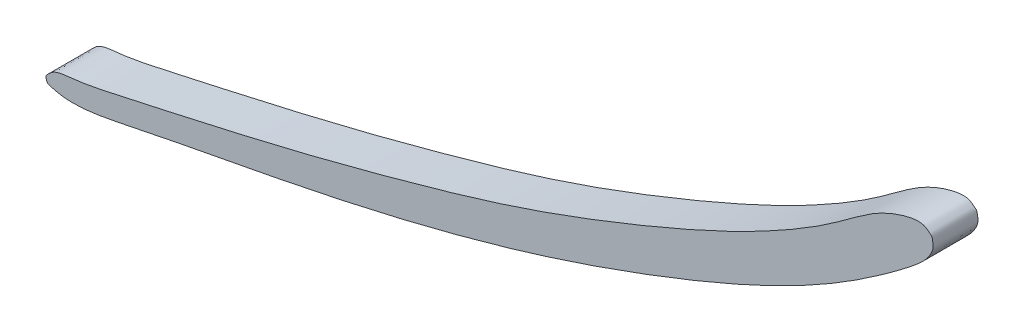
ISO-10303-21;
HEADER;
FILE_DESCRIPTION(('STEP AP214'),'2;1');
FILE_NAME('part.step','',(''),(''),'','','');
FILE_SCHEMA(('AUTOMOTIVE_DESIGN { 1 0 10303 214 1 1 1 1 }'));
ENDSEC;
DATA;
#1=APPLICATION_CONTEXT('core data for automotive mechanical design processes');
#2=APPLICATION_PROTOCOL_DEFINITION('international standard','automotive_design',2000,#1);
#3=PRODUCT_CONTEXT('',#1,'mechanical');
#4=PRODUCT('Part','Part','',(#3));
#5=PRODUCT_RELATED_PRODUCT_CATEGORY('part','',(#4));
#6=PRODUCT_DEFINITION_FORMATION('','',#4);
#7=PRODUCT_DEFINITION_CONTEXT('part definition',#1,'design');
#8=PRODUCT_DEFINITION('design','',#6,#7);
#9=PRODUCT_DEFINITION_SHAPE('','',#8);
#10=(LENGTH_UNIT() NAMED_UNIT(*) SI_UNIT(.MILLI.,.METRE.));
#11=(NAMED_UNIT(*) PLANE_ANGLE_UNIT() SI_UNIT($,.RADIAN.));
#12=(NAMED_UNIT(*) SI_UNIT($,.STERADIAN.) SOLID_ANGLE_UNIT());
#13=UNCERTAINTY_MEASURE_WITH_UNIT(LENGTH_MEASURE(1.E-05),#10,'distance_accuracy_value','');
#14=(GEOMETRIC_REPRESENTATION_CONTEXT(3) GLOBAL_UNCERTAINTY_ASSIGNED_CONTEXT((#13)) GLOBAL_UNIT_ASSIGNED_CONTEXT((#10,
#11,#12)) REPRESENTATION_CONTEXT('',''));
#15=CARTESIAN_POINT('',(0.,0.,0.));
#16=DIRECTION('',(0.,0.,1.));
#17=DIRECTION('',(1.,0.,0.));
#18=AXIS2_PLACEMENT_3D('',#15,#16,#17);
#19=CARTESIAN_POINT('',(92.761237974425,0.,252.));
#20=CARTESIAN_POINT('',(92.7108141675134,0.103484646704672,252.));
#21=CARTESIAN_POINT('',(92.6259286306422,0.181091831557134,252.));
#22=CARTESIAN_POINT('',(92.4512432975805,0.326166599506429,252.));
#23=CARTESIAN_POINT('',(92.3597163546012,0.393318620003691,252.));
#24=CARTESIAN_POINT('',(92.1796091155571,0.531415136201542,252.));
#25=CARTESIAN_POINT('',(92.0905659814435,0.60176393724476,252.));
#26=CARTESIAN_POINT('',(91.9073362656706,0.735841676877275,252.));
#27=CARTESIAN_POINT('',(91.8134565402869,0.79968028601128,252.));
#28=CARTESIAN_POINT('',(91.620956568227,0.916834822233847,252.));
#29=CARTESIAN_POINT('',(91.5220007695223,0.970007795249556,252.));
#30=CARTESIAN_POINT('',(91.3144282778557,1.05705812486876,252.));
#31=CARTESIAN_POINT('',(91.2051845000314,1.09176871129776,252.));
#32=CARTESIAN_POINT('',(90.8724981771278,1.1705970374738,252.));
#33=CARTESIAN_POINT('',(90.6478975826291,1.18983354504489,252.));
#34=CARTESIAN_POINT('',(90.1959797965845,1.19609495239491,252.));
#35=CARTESIAN_POINT('',(89.9682429068782,1.18203517274987,252.));
#36=CARTESIAN_POINT('',(89.5193146730621,1.13775551228659,252.));
#37=CARTESIAN_POINT('',(89.2967960816137,1.10672446128053,252.));
#38=CARTESIAN_POINT('',(88.6344230723274,0.989945620609276,252.));
#39=CARTESIAN_POINT('',(88.1992782062483,0.882674769280027,252.));
#40=CARTESIAN_POINT('',(87.3351883073277,0.639799288821246,252.));
#41=CARTESIAN_POINT('',(86.905468117672,0.501819345664865,252.));
#42=CARTESIAN_POINT('',(86.0583642773821,0.199989917390875,252.));
#43=CARTESIAN_POINT('',(85.6414664248653,0.0369391802921366,252.));
#44=CARTESIAN_POINT('',(84.4094846966544,-0.486340605775482,252.));
#45=CARTESIAN_POINT('',(83.6138329719643,-0.882010988370274,252.));
#46=CARTESIAN_POINT('',(81.3007254071967,-2.20370911744816,252.));
#47=CARTESIAN_POINT('',(79.8504400633676,-3.25231206014543,252.));
#48=CARTESIAN_POINT('',(77.6851013149931,-4.84335413078766,252.));
#49=CARTESIAN_POINT('',(76.9638431036973,-5.37464459943487,252.));
#50=CARTESIAN_POINT('',(75.5110926560402,-6.41871315249909,252.));
#51=CARTESIAN_POINT('',(74.7803319502691,-6.93281450662433,252.));
#52=CARTESIAN_POINT('',(72.5658126430972,-8.43489359395718,252.));
#53=CARTESIAN_POINT('',(71.0612335839795,-9.38520908668451,252.));
#54=CARTESIAN_POINT('',(68.0148183748437,-11.2184455154898,252.));
#55=CARTESIAN_POINT('',(66.4730274538173,-12.1014482665391,252.));
#56=CARTESIAN_POINT('',(63.3618025204323,-13.8174500286862,252.));
#57=CARTESIAN_POINT('',(61.7914527576867,-14.6487925338716,252.));
#58=CARTESIAN_POINT('',(58.622086092469,-16.2596213975174,252.));
#59=CARTESIAN_POINT('',(57.0235353597609,-17.0399510130279,252.));
#60=CARTESIAN_POINT('',(52.1953993375116,-19.3221796914334,252.));
#61=CARTESIAN_POINT('',(48.9352131498174,-20.7702950526704,252.));
#62=CARTESIAN_POINT('',(42.3659299266654,-23.5714276134844,252.));
#63=CARTESIAN_POINT('',(39.0594759006768,-24.920489862075,252.));
#64=CARTESIAN_POINT('',(32.414155338853,-27.5341459342588,252.));
#65=CARTESIAN_POINT('',(29.0756101783204,-28.7979749728205,252.));
#66=CARTESIAN_POINT('',(22.3556272397121,-31.2095264378799,252.));
#67=CARTESIAN_POINT('',(18.9722070358965,-32.3549912595081,252.));
#68=CARTESIAN_POINT('',(12.1694143505046,-34.5239962270596,252.));
#69=CARTESIAN_POINT('',(8.75004057804297,-35.5496315394685,252.));
#70=CARTESIAN_POINT('',(1.88905328669275,-37.5280780186139,252.));
#71=CARTESIAN_POINT('',(-1.55168801831556,-38.4834779095385,252.));
#72=CARTESIAN_POINT('',(-8.44381740384276,-40.3514153528081,252.));
#73=CARTESIAN_POINT('',(-11.8962885321068,-41.2614705007003,252.));
#74=CARTESIAN_POINT('',(-18.8164720246223,-43.0246891879316,252.));
#75=CARTESIAN_POINT('',(-22.2838857434022,-43.8765441100811,252.));
#76=CARTESIAN_POINT('',(-29.2314929546257,-45.5259582911361,252.));
#77=CARTESIAN_POINT('',(-32.7116030389363,-46.3244741422317,252.));
#78=CARTESIAN_POINT('',(-39.6773485258585,-47.8974713722191,252.));
#79=CARTESIAN_POINT('',(-43.1621360711291,-48.6755028654316,252.));
#80=CARTESIAN_POINT('',(-48.391366369212,-49.8332508522108,252.));
#81=CARTESIAN_POINT('',(-50.1350486952621,-50.2164317277858,252.));
#82=CARTESIAN_POINT('',(-52.7522271671821,-50.7836004664604,252.));
#83=CARTESIAN_POINT('',(-53.6247637783556,-50.9720173433587,252.));
#84=CARTESIAN_POINT('',(-55.3706907127172,-51.3446703662805,252.));
#85=CARTESIAN_POINT('',(-56.2445513166113,-51.5266478366601,252.));
#86=CARTESIAN_POINT('',(-58.0016630657518,-51.8450803397475,252.));
#87=CARTESIAN_POINT('',(-58.8835577772947,-51.9809992424093,252.));
#88=CARTESIAN_POINT('',(-60.2124776806721,-52.138277572251,252.));
#89=CARTESIAN_POINT('',(-60.6568668783303,-52.180127303895,252.));
#90=CARTESIAN_POINT('',(-61.5438167744162,-52.2774851801719,252.));
#91=CARTESIAN_POINT('',(-61.9870991177281,-52.3343409756377,252.));
#92=CARTESIAN_POINT('',(-62.6419239201643,-52.4601512758773,252.));
#93=CARTESIAN_POINT('',(-62.8585771748544,-52.5086484129308,252.));
#94=CARTESIAN_POINT('',(-63.2854881092436,-52.6315154574748,252.));
#95=CARTESIAN_POINT('',(-63.4977153155774,-52.7065324598879,252.));
#96=CARTESIAN_POINT('',(-63.9023289626932,-52.8957741062442,252.));
#97=CARTESIAN_POINT('',(-64.090748841481,-53.0104153328487,252.));
#98=CARTESIAN_POINT('',(-64.4415773486813,-53.2771974474135,252.));
#99=CARTESIAN_POINT('',(-64.6055263668091,-53.427605228588,252.));
#100=CARTESIAN_POINT('',(-64.8437580653421,-53.6626621376064,252.));
#101=CARTESIAN_POINT('',(-64.9235112353821,-53.7407060513774,252.));
#102=CARTESIAN_POINT('',(-65.0356672537072,-53.8644992833046,252.));
#103=CARTESIAN_POINT('',(-65.0720453000308,-53.9066703922897,252.));
#104=CARTESIAN_POINT('',(-65.1386187779804,-53.9965777892516,252.));
#105=CARTESIAN_POINT('',(-65.1689900254206,-54.0452940240279,252.));
#106=CARTESIAN_POINT('',(-65.2124825128075,-54.1487259493497,252.));
#107=CARTESIAN_POINT('',(-65.2249485677899,-54.2050382296259,252.));
#108=CARTESIAN_POINT('',(-65.2317359995909,-54.317577814071,252.));
#109=CARTESIAN_POINT('',(-65.2270670690665,-54.3746118750599,252.));
#110=CARTESIAN_POINT('',(-65.1992784689066,-54.541211795871,252.));
#111=CARTESIAN_POINT('',(-65.1658527700346,-54.6477781437659,252.));
#112=CARTESIAN_POINT('',(-65.0907369159004,-54.8584147094741,252.));
#113=CARTESIAN_POINT('',(-65.0475883135727,-54.9639705868207,252.));
#114=CARTESIAN_POINT('',(-64.9526296261461,-55.1025685539792,252.));
#115=CARTESIAN_POINT('',(-64.9143913893313,-55.1454477710383,252.));
#116=CARTESIAN_POINT('',(-64.8279333911284,-55.2166989000543,252.));
#117=CARTESIAN_POINT('',(-64.7782525181241,-55.2454951572673,252.));
#118=CARTESIAN_POINT('',(-64.6226799085615,-55.3096762414277,252.));
#119=CARTESIAN_POINT('',(-64.512192528252,-55.3302440908607,252.));
#120=CARTESIAN_POINT('',(-64.2924773786505,-55.3754245575696,252.));
#121=CARTESIAN_POINT('',(-64.1828708502556,-55.3990547251825,252.));
#122=CARTESIAN_POINT('',(-63.8561864605421,-55.4787900585646,252.));
#123=CARTESIAN_POINT('',(-63.6399906390539,-55.5385489848162,252.));
#124=CARTESIAN_POINT('',(-63.2062654656859,-55.6525428230077,252.));
#125=CARTESIAN_POINT('',(-62.9877759611933,-55.7044562477328,252.));
#126=CARTESIAN_POINT('',(-62.3269688776764,-55.8272214186926,252.));
#127=CARTESIAN_POINT('',(-61.8858511263447,-55.8721338031798,252.));
#128=CARTESIAN_POINT('',(-60.5616440092124,-55.9524733206851,252.));
#129=CARTESIAN_POINT('',(-59.6777939602113,-55.939439094922,252.));
#130=CARTESIAN_POINT('',(-57.9085369216461,-55.8141815786534,252.));
#131=CARTESIAN_POINT('',(-57.0243897050259,-55.7010634554123,252.));
#132=CARTESIAN_POINT('',(-55.2691817082998,-55.4292465066198,252.));
#133=CARTESIAN_POINT('',(-54.395273332224,-55.270760767932,252.));
#134=CARTESIAN_POINT('',(-51.7781332852147,-54.7672924126308,252.));
#135=CARTESIAN_POINT('',(-50.0386469742264,-54.4022070463103,252.));
#136=CARTESIAN_POINT('',(-46.5569119219624,-53.6885945413279,252.));
#137=CARTESIAN_POINT('',(-44.8150066177027,-53.3369351464266,252.));
#138=CARTESIAN_POINT('',(-39.5837557203444,-52.309407701559,252.));
#139=CARTESIAN_POINT('',(-36.090815293946,-51.6522899069141,252.));
#140=CARTESIAN_POINT('',(-29.1071836008098,-50.3268221658076,252.));
#141=CARTESIAN_POINT('',(-25.6167109123825,-49.6573019874036,252.));
#142=CARTESIAN_POINT('',(-18.6462195863543,-48.2668826863462,252.));
#143=CARTESIAN_POINT('',(-15.1660278483846,-47.5467626364748,252.));
#144=CARTESIAN_POINT('',(-8.22028711866685,-46.0343495914155,252.));
#145=CARTESIAN_POINT('',(-4.755012592775,-45.2439010233922,252.));
#146=CARTESIAN_POINT('',(5.60912105412119,-42.7480180250678,252.));
#147=CARTESIAN_POINT('',(12.4819816678569,-40.9190088177092,252.));
#148=CARTESIAN_POINT('',(26.0955250911793,-36.8376147964875,252.));
#149=CARTESIAN_POINT('',(32.8392870212177,-34.5809135567776,252.));
#150=CARTESIAN_POINT('',(42.8480174807664,-30.902589856695,252.));
#151=CARTESIAN_POINT('',(46.1660930533217,-29.6288007000714,252.));
#152=CARTESIAN_POINT('',(52.7479163998227,-26.9774328356744,252.));
#153=CARTESIAN_POINT('',(56.0134570808839,-25.5995431212159,252.));
#154=CARTESIAN_POINT('',(62.4717940572031,-22.6940778803487,252.));
#155=CARTESIAN_POINT('',(65.6637957963914,-21.1648673993084,252.));
#156=CARTESIAN_POINT('',(71.9354044775089,-17.8751721429852,252.));
#157=CARTESIAN_POINT('',(75.0145292886906,-16.1136952893219,252.));
#158=CARTESIAN_POINT('',(79.5295994419861,-13.2582676198945,252.));
#159=CARTESIAN_POINT('',(81.0193911513987,-12.2707931451374,252.));
#160=CARTESIAN_POINT('',(83.9587054138814,-10.2376318538813,252.));
#161=CARTESIAN_POINT('',(85.408768033942,-9.19257237979686,252.));
#162=CARTESIAN_POINT('',(87.5556324640046,-7.58735806283726,252.));
#163=CARTESIAN_POINT('',(88.266951792108,-7.04615679413711,252.));
#164=CARTESIAN_POINT('',(89.3159135280269,-6.21192191260309,252.));
#165=CARTESIAN_POINT('',(89.6617173256856,-5.92922247863999,252.));
#166=CARTESIAN_POINT('',(90.3399763380241,-5.3478018338803,252.));
#167=CARTESIAN_POINT('',(90.673801772376,-5.04928214193821,252.));
#168=CARTESIAN_POINT('',(91.3101043749775,-4.42572315071446,252.));
#169=CARTESIAN_POINT('',(91.6128305502911,-4.10051993560466,252.));
#170=CARTESIAN_POINT('',(92.0274810059248,-3.57839348163093,252.));
#171=CARTESIAN_POINT('',(92.1589381796004,-3.39846874777814,252.));
#172=CARTESIAN_POINT('',(92.4033920338285,-3.02255403161463,252.));
#173=CARTESIAN_POINT('',(92.5158901857807,-2.82649293129567,252.));
#174=CARTESIAN_POINT('',(92.7144299437358,-2.42472367576796,252.));
#175=CARTESIAN_POINT('',(92.8014316602173,-2.21804087174274,252.));
#176=CARTESIAN_POINT('',(92.9316468640349,-1.7849718573417,252.));
#177=CARTESIAN_POINT('',(92.9736712647376,-1.56555762135221,252.));
#178=CARTESIAN_POINT('',(92.9752624130343,-1.22877068243954,252.));
#179=CARTESIAN_POINT('',(92.9644787022065,-1.11473551036678,252.));
#180=CARTESIAN_POINT('',(92.93179441828,-0.890388758287563,252.));
#181=CARTESIAN_POINT('',(92.9096271241795,-0.779239153712251,252.));
#182=CARTESIAN_POINT('',(92.8678663970927,-0.556487588039554,252.));
#183=CARTESIAN_POINT('',(92.8517007001448,-0.444283201759012,252.));
#184=CARTESIAN_POINT('',(92.8295761867728,-0.275603323349345,252.));
#185=CARTESIAN_POINT('',(92.8226862625582,-0.21929147357045,252.));
#186=CARTESIAN_POINT('',(92.8015474004869,-0.1079611218937,252.));
#187=CARTESIAN_POINT('',(92.7864498778807,-0.0517423233523314,252.));
#188=CARTESIAN_POINT('',(92.761237974425,0.,252.));
#189=B_SPLINE_CURVE_WITH_KNOTS('',3,(#19,#20,#21,#22,#23,#24,#25,#26,#27,#28,#29,#30,#31,#32,
#33,#34,#35,#36,#37,#38,#39,#40,#41,#42,#43,#44,#45,#46,#47,#48,#49,#50,#51,#52,#53,#54,#55,#56,
#57,#58,#59,#60,#61,#62,#63,#64,#65,#66,#67,#68,#69,#70,#71,#72,#73,#74,#75,#76,#77,#78,#79,#80,
#81,#82,#83,#84,#85,#86,#87,#88,#89,#90,#91,#92,#93,#94,#95,#96,#97,#98,#99,#100,#101,#102,#103,
#104,#105,#106,#107,#108,#109,#110,#111,#112,#113,#114,#115,#116,#117,#118,#119,#120,#121,#122,
#123,#124,#125,#126,#127,#128,#129,#130,#131,#132,#133,#134,#135,#136,#137,#138,#139,#140,#141,
#142,#143,#144,#145,#146,#147,#148,#149,#150,#151,#152,#153,#154,#155,#156,#157,#158,#159,#160,
#161,#162,#163,#164,#165,#166,#167,#168,#169,#170,#171,#172,#173,#174,#175,#176,#177,#178,#179,
#180,#181,#182,#183,#184,#185,#186,#187,#188),.UNSPECIFIED.,.T.,.F.,(4,2,2,2,2,2,2,2,2,2,2,2,2,
2,2,2,2,2,2,2,2,2,2,2,2,2,2,2,2,2,2,2,2,2,2,2,2,2,2,2,2,2,2,2,2,2,2,2,2,2,2,2,2,2,2,2,2,2,2,2,2,
2,2,2,2,2,2,2,2,2,2,2,2,2,2,2,2,2,2,2,2,2,2,2,4),(0.,0.000976562499999877,0.00195312499999975,
0.00292968749999963,0.00390624999999951,0.00488281249999939,0.00585937499999926,
0.00781249999999902,0.00976562499999877,0.0117187499999985,0.0156249999999982,
0.0195312499999978,0.0234374999999974,0.0312499999999968,0.0468749999999956,0.054687499999995,
0.0624999999999944,0.0781249999999931,0.0937499999999918,0.109374999999991,0.124999999999989,
0.156249999999987,0.187499999999984,0.218749999999982,0.249999999999979,0.281249999999976,
0.312499999999974,0.343749999999971,0.374999999999969,0.406249999999966,0.437499999999964,
0.453124999999962,0.460937499999962,0.468749999999961,0.47656249999996,0.48046874999996,
0.48437499999996,0.48632812499996,0.488281249999959,0.490234374999959,0.492187499999959,
0.493164062499959,0.493652343749959,0.494140624999959,0.494628906249959,0.495117187499959,
0.496093749999959,0.497070312499959,0.497558593749959,0.498046874999959,0.499023437499959,
0.499999999999959,0.50195312499996,0.50390624999996,0.50781249999996,0.515624999999961,
0.523437499999962,0.531249999999962,0.546874999999964,0.562499999999965,0.593749999999967,
0.62499999999997,0.656249999999972,0.687499999999975,0.74999999999998,0.812499999999985,
0.843749999999987,0.87499999999999,0.906249999999992,0.937499999999995,0.953124999999996,
0.968749999999997,0.976562499999998,0.980468749999998,0.984374999999999,0.988281249999999,
0.990234374999999,0.992187499999999,0.994140625,0.99609375,0.9970703125,0.998046875,
0.9990234375,0.99951171875,1.),.UNSPECIFIED.);
#190=DIRECTION('',(0.,0.,-1.));
#191=VECTOR('',#190,1.);
#192=SURFACE_OF_LINEAR_EXTRUSION('',#189,#191);
#193=CARTESIAN_POINT('',(92.761237974425,0.,252.));
#194=CARTESIAN_POINT('',(92.7864498778807,-0.0517423233523314,252.));
#195=CARTESIAN_POINT('',(92.8015474004869,-0.1079611218937,252.));
#196=CARTESIAN_POINT('',(92.8226862625582,-0.21929147357045,252.));
#197=CARTESIAN_POINT('',(92.8295761867728,-0.275603323349345,252.));
#198=CARTESIAN_POINT('',(92.8517007001448,-0.444283201759012,252.));
#199=CARTESIAN_POINT('',(92.8678663970927,-0.556487588039554,252.));
#200=CARTESIAN_POINT('',(92.9096271241795,-0.779239153712251,252.));
#201=CARTESIAN_POINT('',(92.93179441828,-0.890388758287563,252.));
#202=CARTESIAN_POINT('',(92.9644787022065,-1.11473551036678,252.));
#203=CARTESIAN_POINT('',(92.9752624130343,-1.22877068243954,252.));
#204=CARTESIAN_POINT('',(92.9736712647376,-1.56555762135221,252.));
#205=CARTESIAN_POINT('',(92.9316468640349,-1.7849718573417,252.));
#206=CARTESIAN_POINT('',(92.8014316602173,-2.21804087174274,252.));
#207=CARTESIAN_POINT('',(92.7144299437358,-2.42472367576796,252.));
#208=CARTESIAN_POINT('',(92.5158901857807,-2.82649293129567,252.));
#209=CARTESIAN_POINT('',(92.4033920338285,-3.02255403161463,252.));
#210=CARTESIAN_POINT('',(92.1589381796004,-3.39846874777814,252.));
#211=CARTESIAN_POINT('',(92.0274810059248,-3.57839348163093,252.));
#212=CARTESIAN_POINT('',(91.6128305502911,-4.10051993560466,252.));
#213=CARTESIAN_POINT('',(91.3101043749775,-4.42572315071446,252.));
#214=CARTESIAN_POINT('',(90.673801772376,-5.04928214193821,252.));
#215=CARTESIAN_POINT('',(90.3399763380241,-5.3478018338803,252.));
#216=CARTESIAN_POINT('',(89.6617173256856,-5.92922247863999,252.));
#217=CARTESIAN_POINT('',(89.3159135280269,-6.21192191260309,252.));
#218=CARTESIAN_POINT('',(88.266951792108,-7.04615679413711,252.));
#219=CARTESIAN_POINT('',(87.5556324640046,-7.58735806283726,252.));
#220=CARTESIAN_POINT('',(85.408768033942,-9.19257237979686,252.));
#221=CARTESIAN_POINT('',(83.9587054138814,-10.2376318538813,252.));
#222=CARTESIAN_POINT('',(81.0193911513987,-12.2707931451374,252.));
#223=CARTESIAN_POINT('',(79.5295994419861,-13.2582676198945,252.));
#224=CARTESIAN_POINT('',(75.0145292886906,-16.1136952893219,252.));
#225=CARTESIAN_POINT('',(71.9354044775089,-17.8751721429852,252.));
#226=CARTESIAN_POINT('',(65.6637957963914,-21.1648673993084,252.));
#227=CARTESIAN_POINT('',(62.4717940572031,-22.6940778803487,252.));
#228=CARTESIAN_POINT('',(56.0134570808839,-25.5995431212159,252.));
#229=CARTESIAN_POINT('',(52.7479163998227,-26.9774328356744,252.));
#230=CARTESIAN_POINT('',(46.1660930533217,-29.6288007000714,252.));
#231=CARTESIAN_POINT('',(42.8480174807664,-30.902589856695,252.));
#232=CARTESIAN_POINT('',(32.8392870212177,-34.5809135567776,252.));
#233=CARTESIAN_POINT('',(26.0955250911793,-36.8376147964875,252.));
#234=CARTESIAN_POINT('',(12.4819816678569,-40.9190088177092,252.));
#235=CARTESIAN_POINT('',(5.60912105412119,-42.7480180250678,252.));
#236=CARTESIAN_POINT('',(-4.755012592775,-45.2439010233922,252.));
#237=CARTESIAN_POINT('',(-8.22028711866685,-46.0343495914155,252.));
#238=CARTESIAN_POINT('',(-15.1660278483846,-47.5467626364748,252.));
#239=CARTESIAN_POINT('',(-18.6462195863543,-48.2668826863462,252.));
#240=CARTESIAN_POINT('',(-25.6167109123825,-49.6573019874036,252.));
#241=CARTESIAN_POINT('',(-29.1071836008098,-50.3268221658076,252.));
#242=CARTESIAN_POINT('',(-36.090815293946,-51.6522899069141,252.));
#243=CARTESIAN_POINT('',(-39.5837557203444,-52.309407701559,252.));
#244=CARTESIAN_POINT('',(-44.8150066177027,-53.3369351464266,252.));
#245=CARTESIAN_POINT('',(-46.5569119219624,-53.6885945413279,252.));
#246=CARTESIAN_POINT('',(-50.0386469742264,-54.4022070463103,252.));
#247=CARTESIAN_POINT('',(-51.7781332852147,-54.7672924126308,252.));
#248=CARTESIAN_POINT('',(-54.395273332224,-55.270760767932,252.));
#249=CARTESIAN_POINT('',(-55.2691817082998,-55.4292465066198,252.));
#250=CARTESIAN_POINT('',(-57.0243897050259,-55.7010634554123,252.));
#251=CARTESIAN_POINT('',(-57.9085369216461,-55.8141815786534,252.));
#252=CARTESIAN_POINT('',(-59.6777939602113,-55.939439094922,252.));
#253=CARTESIAN_POINT('',(-60.5616440092124,-55.9524733206851,252.));
#254=CARTESIAN_POINT('',(-61.8858511263447,-55.8721338031798,252.));
#255=CARTESIAN_POINT('',(-62.3269688776764,-55.8272214186926,252.));
#256=CARTESIAN_POINT('',(-62.9877759611933,-55.7044562477328,252.));
#257=CARTESIAN_POINT('',(-63.2062654656859,-55.6525428230077,252.));
#258=CARTESIAN_POINT('',(-63.6399906390539,-55.5385489848162,252.));
#259=CARTESIAN_POINT('',(-63.8561864605421,-55.4787900585646,252.));
#260=CARTESIAN_POINT('',(-64.1828708502556,-55.3990547251825,252.));
#261=CARTESIAN_POINT('',(-64.2924773786505,-55.3754245575696,252.));
#262=CARTESIAN_POINT('',(-64.512192528252,-55.3302440908607,252.));
#263=CARTESIAN_POINT('',(-64.6226799085615,-55.3096762414277,252.));
#264=CARTESIAN_POINT('',(-64.7782525181241,-55.2454951572673,252.));
#265=CARTESIAN_POINT('',(-64.8279333911284,-55.2166989000543,252.));
#266=CARTESIAN_POINT('',(-64.9143913893313,-55.1454477710383,252.));
#267=CARTESIAN_POINT('',(-64.9526296261461,-55.1025685539792,252.));
#268=CARTESIAN_POINT('',(-65.0475883135727,-54.9639705868207,252.));
#269=CARTESIAN_POINT('',(-65.0907369159004,-54.8584147094741,252.));
#270=CARTESIAN_POINT('',(-65.1658527700346,-54.6477781437659,252.));
#271=CARTESIAN_POINT('',(-65.1992784689066,-54.541211795871,252.));
#272=CARTESIAN_POINT('',(-65.2270670690665,-54.3746118750599,252.));
#273=CARTESIAN_POINT('',(-65.2317359995909,-54.317577814071,252.));
#274=CARTESIAN_POINT('',(-65.2249485677899,-54.2050382296259,252.));
#275=CARTESIAN_POINT('',(-65.2124825128075,-54.1487259493497,252.));
#276=CARTESIAN_POINT('',(-65.1689900254206,-54.0452940240279,252.));
#277=CARTESIAN_POINT('',(-65.1386187779804,-53.9965777892516,252.));
#278=CARTESIAN_POINT('',(-65.0720453000308,-53.9066703922897,252.));
#279=CARTESIAN_POINT('',(-65.0356672537072,-53.8644992833046,252.));
#280=CARTESIAN_POINT('',(-64.9235112353821,-53.7407060513774,252.));
#281=CARTESIAN_POINT('',(-64.8437580653421,-53.6626621376064,252.));
#282=CARTESIAN_POINT('',(-64.6055263668091,-53.427605228588,252.));
#283=CARTESIAN_POINT('',(-64.4415773486813,-53.2771974474135,252.));
#284=CARTESIAN_POINT('',(-64.090748841481,-53.0104153328487,252.));
#285=CARTESIAN_POINT('',(-63.9023289626932,-52.8957741062442,252.));
#286=CARTESIAN_POINT('',(-63.4977153155774,-52.7065324598879,252.));
#287=CARTESIAN_POINT('',(-63.2854881092436,-52.6315154574748,252.));
#288=CARTESIAN_POINT('',(-62.8585771748544,-52.5086484129308,252.));
#289=CARTESIAN_POINT('',(-62.6419239201643,-52.4601512758773,252.));
#290=CARTESIAN_POINT('',(-61.9870991177281,-52.3343409756377,252.));
#291=CARTESIAN_POINT('',(-61.5438167744162,-52.2774851801719,252.));
#292=CARTESIAN_POINT('',(-60.6568668783303,-52.180127303895,252.));
#293=CARTESIAN_POINT('',(-60.2124776806721,-52.138277572251,252.));
#294=CARTESIAN_POINT('',(-58.8835577772947,-51.9809992424093,252.));
#295=CARTESIAN_POINT('',(-58.0016630657518,-51.8450803397475,252.));
#296=CARTESIAN_POINT('',(-56.2445513166113,-51.5266478366601,252.));
#297=CARTESIAN_POINT('',(-55.3706907127172,-51.3446703662805,252.));
#298=CARTESIAN_POINT('',(-53.6247637783556,-50.9720173433587,252.));
#299=CARTESIAN_POINT('',(-52.7522271671821,-50.7836004664604,252.));
#300=CARTESIAN_POINT('',(-50.1350486952621,-50.2164317277858,252.));
#301=CARTESIAN_POINT('',(-48.391366369212,-49.8332508522108,252.));
#302=CARTESIAN_POINT('',(-43.1621360711291,-48.6755028654316,252.));
#303=CARTESIAN_POINT('',(-39.6773485258585,-47.8974713722191,252.));
#304=CARTESIAN_POINT('',(-32.7116030389363,-46.3244741422317,252.));
#305=CARTESIAN_POINT('',(-29.2314929546257,-45.5259582911361,252.));
#306=CARTESIAN_POINT('',(-22.2838857434022,-43.8765441100811,252.));
#307=CARTESIAN_POINT('',(-18.8164720246223,-43.0246891879316,252.));
#308=CARTESIAN_POINT('',(-11.8962885321068,-41.2614705007003,252.));
#309=CARTESIAN_POINT('',(-8.44381740384276,-40.3514153528081,252.));
#310=CARTESIAN_POINT('',(-1.55168801831556,-38.4834779095385,252.));
#311=CARTESIAN_POINT('',(1.88905328669275,-37.5280780186139,252.));
#312=CARTESIAN_POINT('',(8.75004057804297,-35.5496315394685,252.));
#313=CARTESIAN_POINT('',(12.1694143505046,-34.5239962270596,252.));
#314=CARTESIAN_POINT('',(18.9722070358965,-32.3549912595081,252.));
#315=CARTESIAN_POINT('',(22.3556272397121,-31.2095264378799,252.));
#316=CARTESIAN_POINT('',(29.0756101783204,-28.7979749728205,252.));
#317=CARTESIAN_POINT('',(32.414155338853,-27.5341459342588,252.));
#318=CARTESIAN_POINT('',(39.0594759006768,-24.920489862075,252.));
#319=CARTESIAN_POINT('',(42.3659299266654,-23.5714276134844,252.));
#320=CARTESIAN_POINT('',(48.9352131498174,-20.7702950526704,252.));
#321=CARTESIAN_POINT('',(52.1953993375116,-19.3221796914334,252.));
#322=CARTESIAN_POINT('',(57.0235353597609,-17.0399510130279,252.));
#323=CARTESIAN_POINT('',(58.622086092469,-16.2596213975174,252.));
#324=CARTESIAN_POINT('',(61.7914527576867,-14.6487925338716,252.));
#325=CARTESIAN_POINT('',(63.3618025204323,-13.8174500286862,252.));
#326=CARTESIAN_POINT('',(66.4730274538173,-12.1014482665391,252.));
#327=CARTESIAN_POINT('',(68.0148183748437,-11.2184455154898,252.));
#328=CARTESIAN_POINT('',(71.0612335839795,-9.38520908668451,252.));
#329=CARTESIAN_POINT('',(72.5658126430972,-8.43489359395718,252.));
#330=CARTESIAN_POINT('',(74.7803319502691,-6.93281450662433,252.));
#331=CARTESIAN_POINT('',(75.5110926560402,-6.41871315249909,252.));
#332=CARTESIAN_POINT('',(76.9638431036973,-5.37464459943487,252.));
#333=CARTESIAN_POINT('',(77.6851013149931,-4.84335413078766,252.));
#334=CARTESIAN_POINT('',(79.8504400633676,-3.25231206014543,252.));
#335=CARTESIAN_POINT('',(81.3007254071967,-2.20370911744816,252.));
#336=CARTESIAN_POINT('',(83.6138329719643,-0.882010988370274,252.));
#337=CARTESIAN_POINT('',(84.4094846966544,-0.486340605775482,252.));
#338=CARTESIAN_POINT('',(85.6414664248653,0.0369391802921366,252.));
#339=CARTESIAN_POINT('',(86.0583642773821,0.199989917390875,252.));
#340=CARTESIAN_POINT('',(86.905468117672,0.501819345664865,252.));
#341=CARTESIAN_POINT('',(87.3351883073277,0.639799288821246,252.));
#342=CARTESIAN_POINT('',(88.1992782062483,0.882674769280027,252.));
#343=CARTESIAN_POINT('',(88.6344230723274,0.989945620609276,252.));
#344=CARTESIAN_POINT('',(89.2967960816137,1.10672446128053,252.));
#345=CARTESIAN_POINT('',(89.5193146730621,1.13775551228659,252.));
#346=CARTESIAN_POINT('',(89.9682429068782,1.18203517274987,252.));
#347=CARTESIAN_POINT('',(90.1959797965845,1.19609495239491,252.));
#348=CARTESIAN_POINT('',(90.6478975826291,1.18983354504489,252.));
#349=CARTESIAN_POINT('',(90.8724981771278,1.1705970374738,252.));
#350=CARTESIAN_POINT('',(91.2051845000314,1.09176871129776,252.));
#351=CARTESIAN_POINT('',(91.3144282778557,1.05705812486876,252.));
#352=CARTESIAN_POINT('',(91.5220007695223,0.970007795249556,252.));
#353=CARTESIAN_POINT('',(91.620956568227,0.916834822233847,252.));
#354=CARTESIAN_POINT('',(91.8134565402869,0.79968028601128,252.));
#355=CARTESIAN_POINT('',(91.9073362656706,0.735841676877275,252.));
#356=CARTESIAN_POINT('',(92.0905659814435,0.60176393724476,252.));
#357=CARTESIAN_POINT('',(92.1796091155571,0.531415136201542,252.));
#358=CARTESIAN_POINT('',(92.3597163546012,0.393318620003691,252.));
#359=CARTESIAN_POINT('',(92.4512432975805,0.326166599506429,252.));
#360=CARTESIAN_POINT('',(92.6259286306422,0.181091831557134,252.));
#361=CARTESIAN_POINT('',(92.7108141675134,0.103484646704672,252.));
#362=CARTESIAN_POINT('',(92.761237974425,0.,252.));
#363=B_SPLINE_CURVE_WITH_KNOTS('',3,(#193,#194,#195,#196,#197,#198,#199,#200,#201,#202,#203,
#204,#205,#206,#207,#208,#209,#210,#211,#212,#213,#214,#215,#216,#217,#218,#219,#220,#221,#222,
#223,#224,#225,#226,#227,#228,#229,#230,#231,#232,#233,#234,#235,#236,#237,#238,#239,#240,#241,
#242,#243,#244,#245,#246,#247,#248,#249,#250,#251,#252,#253,#254,#255,#256,#257,#258,#259,#260,
#261,#262,#263,#264,#265,#266,#267,#268,#269,#270,#271,#272,#273,#274,#275,#276,#277,#278,#279,
#280,#281,#282,#283,#284,#285,#286,#287,#288,#289,#290,#291,#292,#293,#294,#295,#296,#297,#298,
#299,#300,#301,#302,#303,#304,#305,#306,#307,#308,#309,#310,#311,#312,#313,#314,#315,#316,#317,
#318,#319,#320,#321,#322,#323,#324,#325,#326,#327,#328,#329,#330,#331,#332,#333,#334,#335,#336,
#337,#338,#339,#340,#341,#342,#343,#344,#345,#346,#347,#348,#349,#350,#351,#352,#353,#354,#355,
#356,#357,#358,#359,#360,#361,#362),.UNSPECIFIED.,.T.,.F.,(4,2,2,2,2,2,2,2,2,2,2,2,2,2,2,2,2,2,
2,2,2,2,2,2,2,2,2,2,2,2,2,2,2,2,2,2,2,2,2,2,2,2,2,2,2,2,2,2,2,2,2,2,2,2,2,2,2,2,2,2,2,2,2,2,2,2,
2,2,2,2,2,2,2,2,2,2,2,2,2,2,2,2,2,2,4),(0.,0.000488281249999889,0.0009765625,
0.00195312500000011,0.00292968750000022,0.00390625000000033,0.00585937500000044,
0.00781250000000067,0.00976562500000089,0.0117187500000011,0.0156250000000013,
0.0195312500000017,0.0234375000000019,0.0312500000000026,0.0468750000000038,0.062500000000005,
0.0937500000000075,0.12500000000001,0.156250000000013,0.187500000000015,0.25000000000002,
0.312500000000025,0.343750000000028,0.37500000000003,0.406250000000033,0.437500000000035,
0.453125000000036,0.468750000000038,0.476562500000038,0.484375000000039,0.49218750000004,
0.49609375000004,0.49804687500004,0.500000000000041,0.500976562500041,0.501953125000041,
0.502441406250041,0.502929687500041,0.503906250000041,0.504882812500041,0.505371093750041,
0.505859375000041,0.506347656250041,0.506835937500041,0.507812500000041,0.509765625000041,
0.511718750000041,0.51367187500004,0.51562500000004,0.51953125000004,0.52343750000004,
0.531250000000039,0.539062500000038,0.546875000000038,0.562500000000036,0.593750000000034,
0.625000000000031,0.656250000000029,0.687500000000026,0.718750000000024,0.750000000000021,
0.781250000000018,0.812500000000016,0.843750000000013,0.875000000000011,0.890625000000009,
0.906250000000008,0.921875000000007,0.937500000000006,0.945312500000005,0.953125000000004,
0.968750000000003,0.976562500000003,0.980468750000002,0.984375000000002,0.988281250000001,
0.990234375000001,0.992187500000001,0.994140625000001,0.995117187500001,0.99609375,0.9970703125,
0.998046875,0.9990234375,1.),.UNSPECIFIED.);
#364=CARTESIAN_POINT('',(92.761237974425,0.,252.));
#365=VERTEX_POINT('',#364);
#366=EDGE_CURVE('E10',#365,#365,#363,.F.);
#367=ORIENTED_EDGE('',*,*,#366,.F.);
#368=EDGE_LOOP('',(#367));
#369=FACE_BOUND('',#368,.T.);
#370=CARTESIAN_POINT('',(92.761237974425,0.,244.));
#371=CARTESIAN_POINT('',(92.7108141675134,0.103484646704672,244.));
#372=CARTESIAN_POINT('',(92.6259286306422,0.181091831557134,244.));
#373=CARTESIAN_POINT('',(92.4512432975805,0.326166599506429,244.));
#374=CARTESIAN_POINT('',(92.3597163546012,0.393318620003691,244.));
#375=CARTESIAN_POINT('',(92.1796091155571,0.531415136201542,244.));
#376=CARTESIAN_POINT('',(92.0905659814435,0.60176393724476,244.));
#377=CARTESIAN_POINT('',(91.9073362656706,0.735841676877275,244.));
#378=CARTESIAN_POINT('',(91.8134565402869,0.79968028601128,244.));
#379=CARTESIAN_POINT('',(91.620956568227,0.916834822233847,244.));
#380=CARTESIAN_POINT('',(91.5220007695223,0.970007795249556,244.));
#381=CARTESIAN_POINT('',(91.3144282778557,1.05705812486876,244.));
#382=CARTESIAN_POINT('',(91.2051845000314,1.09176871129776,244.));
#383=CARTESIAN_POINT('',(90.8724981771278,1.1705970374738,244.));
#384=CARTESIAN_POINT('',(90.6478975826291,1.18983354504489,244.));
#385=CARTESIAN_POINT('',(90.1959797965845,1.19609495239491,244.));
#386=CARTESIAN_POINT('',(89.9682429068782,1.18203517274987,244.));
#387=CARTESIAN_POINT('',(89.5193146730621,1.13775551228659,244.));
#388=CARTESIAN_POINT('',(89.2967960816137,1.10672446128053,244.));
#389=CARTESIAN_POINT('',(88.6344230723274,0.989945620609276,244.));
#390=CARTESIAN_POINT('',(88.1992782062483,0.882674769280027,244.));
#391=CARTESIAN_POINT('',(87.3351883073277,0.639799288821246,244.));
#392=CARTESIAN_POINT('',(86.905468117672,0.501819345664865,244.));
#393=CARTESIAN_POINT('',(86.0583642773821,0.199989917390875,244.));
#394=CARTESIAN_POINT('',(85.6414664248653,0.0369391802921366,244.));
#395=CARTESIAN_POINT('',(84.4094846966544,-0.486340605775482,244.));
#396=CARTESIAN_POINT('',(83.6138329719643,-0.882010988370274,244.));
#397=CARTESIAN_POINT('',(81.3007254071967,-2.20370911744816,244.));
#398=CARTESIAN_POINT('',(79.8504400633676,-3.25231206014543,244.));
#399=CARTESIAN_POINT('',(77.6851013149931,-4.84335413078766,244.));
#400=CARTESIAN_POINT('',(76.9638431036973,-5.37464459943487,244.));
#401=CARTESIAN_POINT('',(75.5110926560402,-6.41871315249909,244.));
#402=CARTESIAN_POINT('',(74.7803319502691,-6.93281450662433,244.));
#403=CARTESIAN_POINT('',(72.5658126430972,-8.43489359395718,244.));
#404=CARTESIAN_POINT('',(71.0612335839795,-9.38520908668451,244.));
#405=CARTESIAN_POINT('',(68.0148183748437,-11.2184455154898,244.));
#406=CARTESIAN_POINT('',(66.4730274538173,-12.1014482665391,244.));
#407=CARTESIAN_POINT('',(63.3618025204323,-13.8174500286862,244.));
#408=CARTESIAN_POINT('',(61.7914527576867,-14.6487925338716,244.));
#409=CARTESIAN_POINT('',(58.622086092469,-16.2596213975174,244.));
#410=CARTESIAN_POINT('',(57.0235353597609,-17.0399510130279,244.));
#411=CARTESIAN_POINT('',(52.1953993375116,-19.3221796914334,244.));
#412=CARTESIAN_POINT('',(48.9352131498174,-20.7702950526704,244.));
#413=CARTESIAN_POINT('',(42.3659299266654,-23.5714276134844,244.));
#414=CARTESIAN_POINT('',(39.0594759006768,-24.920489862075,244.));
#415=CARTESIAN_POINT('',(32.414155338853,-27.5341459342588,244.));
#416=CARTESIAN_POINT('',(29.0756101783204,-28.7979749728205,244.));
#417=CARTESIAN_POINT('',(22.3556272397121,-31.2095264378799,244.));
#418=CARTESIAN_POINT('',(18.9722070358965,-32.3549912595081,244.));
#419=CARTESIAN_POINT('',(12.1694143505046,-34.5239962270596,244.));
#420=CARTESIAN_POINT('',(8.75004057804297,-35.5496315394685,244.));
#421=CARTESIAN_POINT('',(1.88905328669275,-37.5280780186139,244.));
#422=CARTESIAN_POINT('',(-1.55168801831556,-38.4834779095385,244.));
#423=CARTESIAN_POINT('',(-8.44381740384276,-40.3514153528081,244.));
#424=CARTESIAN_POINT('',(-11.8962885321068,-41.2614705007003,244.));
#425=CARTESIAN_POINT('',(-18.8164720246223,-43.0246891879316,244.));
#426=CARTESIAN_POINT('',(-22.2838857434022,-43.8765441100811,244.));
#427=CARTESIAN_POINT('',(-29.2314929546257,-45.5259582911361,244.));
#428=CARTESIAN_POINT('',(-32.7116030389363,-46.3244741422317,244.));
#429=CARTESIAN_POINT('',(-39.6773485258585,-47.8974713722191,244.));
#430=CARTESIAN_POINT('',(-43.1621360711291,-48.6755028654316,244.));
#431=CARTESIAN_POINT('',(-48.391366369212,-49.8332508522108,244.));
#432=CARTESIAN_POINT('',(-50.1350486952621,-50.2164317277858,244.));
#433=CARTESIAN_POINT('',(-52.7522271671821,-50.7836004664604,244.));
#434=CARTESIAN_POINT('',(-53.6247637783556,-50.9720173433587,244.));
#435=CARTESIAN_POINT('',(-55.3706907127172,-51.3446703662805,244.));
#436=CARTESIAN_POINT('',(-56.2445513166113,-51.5266478366601,244.));
#437=CARTESIAN_POINT('',(-58.0016630657518,-51.8450803397475,244.));
#438=CARTESIAN_POINT('',(-58.8835577772947,-51.9809992424093,244.));
#439=CARTESIAN_POINT('',(-60.2124776806721,-52.138277572251,244.));
#440=CARTESIAN_POINT('',(-60.6568668783303,-52.180127303895,244.));
#441=CARTESIAN_POINT('',(-61.5438167744162,-52.2774851801719,244.));
#442=CARTESIAN_POINT('',(-61.9870991177281,-52.3343409756377,244.));
#443=CARTESIAN_POINT('',(-62.6419239201643,-52.4601512758773,244.));
#444=CARTESIAN_POINT('',(-62.8585771748544,-52.5086484129308,244.));
#445=CARTESIAN_POINT('',(-63.2854881092436,-52.6315154574748,244.));
#446=CARTESIAN_POINT('',(-63.4977153155774,-52.7065324598879,244.));
#447=CARTESIAN_POINT('',(-63.9023289626932,-52.8957741062442,244.));
#448=CARTESIAN_POINT('',(-64.090748841481,-53.0104153328487,244.));
#449=CARTESIAN_POINT('',(-64.4415773486813,-53.2771974474135,244.));
#450=CARTESIAN_POINT('',(-64.6055263668091,-53.427605228588,244.));
#451=CARTESIAN_POINT('',(-64.8437580653421,-53.6626621376064,244.));
#452=CARTESIAN_POINT('',(-64.9235112353821,-53.7407060513774,244.));
#453=CARTESIAN_POINT('',(-65.0356672537072,-53.8644992833046,244.));
#454=CARTESIAN_POINT('',(-65.0720453000308,-53.9066703922897,244.));
#455=CARTESIAN_POINT('',(-65.1386187779804,-53.9965777892516,244.));
#456=CARTESIAN_POINT('',(-65.1689900254206,-54.0452940240279,244.));
#457=CARTESIAN_POINT('',(-65.2124825128075,-54.1487259493497,244.));
#458=CARTESIAN_POINT('',(-65.2249485677899,-54.2050382296259,244.));
#459=CARTESIAN_POINT('',(-65.2317359995909,-54.317577814071,244.));
#460=CARTESIAN_POINT('',(-65.2270670690665,-54.3746118750599,244.));
#461=CARTESIAN_POINT('',(-65.1992784689066,-54.541211795871,244.));
#462=CARTESIAN_POINT('',(-65.1658527700346,-54.6477781437659,244.));
#463=CARTESIAN_POINT('',(-65.0907369159004,-54.8584147094741,244.));
#464=CARTESIAN_POINT('',(-65.0475883135727,-54.9639705868207,244.));
#465=CARTESIAN_POINT('',(-64.9526296261461,-55.1025685539792,244.));
#466=CARTESIAN_POINT('',(-64.9143913893313,-55.1454477710383,244.));
#467=CARTESIAN_POINT('',(-64.8279333911284,-55.2166989000543,244.));
#468=CARTESIAN_POINT('',(-64.7782525181241,-55.2454951572673,244.));
#469=CARTESIAN_POINT('',(-64.6226799085615,-55.3096762414277,244.));
#470=CARTESIAN_POINT('',(-64.512192528252,-55.3302440908607,244.));
#471=CARTESIAN_POINT('',(-64.2924773786505,-55.3754245575696,244.));
#472=CARTESIAN_POINT('',(-64.1828708502556,-55.3990547251825,244.));
#473=CARTESIAN_POINT('',(-63.8561864605421,-55.4787900585646,244.));
#474=CARTESIAN_POINT('',(-63.6399906390539,-55.5385489848162,244.));
#475=CARTESIAN_POINT('',(-63.2062654656859,-55.6525428230077,244.));
#476=CARTESIAN_POINT('',(-62.9877759611933,-55.7044562477328,244.));
#477=CARTESIAN_POINT('',(-62.3269688776764,-55.8272214186926,244.));
#478=CARTESIAN_POINT('',(-61.8858511263447,-55.8721338031798,244.));
#479=CARTESIAN_POINT('',(-60.5616440092124,-55.9524733206851,244.));
#480=CARTESIAN_POINT('',(-59.6777939602113,-55.939439094922,244.));
#481=CARTESIAN_POINT('',(-57.9085369216461,-55.8141815786534,244.));
#482=CARTESIAN_POINT('',(-57.0243897050259,-55.7010634554123,244.));
#483=CARTESIAN_POINT('',(-55.2691817082998,-55.4292465066198,244.));
#484=CARTESIAN_POINT('',(-54.395273332224,-55.270760767932,244.));
#485=CARTESIAN_POINT('',(-51.7781332852147,-54.7672924126308,244.));
#486=CARTESIAN_POINT('',(-50.0386469742264,-54.4022070463103,244.));
#487=CARTESIAN_POINT('',(-46.5569119219624,-53.6885945413279,244.));
#488=CARTESIAN_POINT('',(-44.8150066177027,-53.3369351464266,244.));
#489=CARTESIAN_POINT('',(-39.5837557203444,-52.309407701559,244.));
#490=CARTESIAN_POINT('',(-36.090815293946,-51.6522899069141,244.));
#491=CARTESIAN_POINT('',(-29.1071836008098,-50.3268221658076,244.));
#492=CARTESIAN_POINT('',(-25.6167109123825,-49.6573019874036,244.));
#493=CARTESIAN_POINT('',(-18.6462195863543,-48.2668826863462,244.));
#494=CARTESIAN_POINT('',(-15.1660278483846,-47.5467626364748,244.));
#495=CARTESIAN_POINT('',(-8.22028711866685,-46.0343495914155,244.));
#496=CARTESIAN_POINT('',(-4.755012592775,-45.2439010233922,244.));
#497=CARTESIAN_POINT('',(5.60912105412119,-42.7480180250678,244.));
#498=CARTESIAN_POINT('',(12.4819816678569,-40.9190088177092,244.));
#499=CARTESIAN_POINT('',(26.0955250911793,-36.8376147964875,244.));
#500=CARTESIAN_POINT('',(32.8392870212177,-34.5809135567776,244.));
#501=CARTESIAN_POINT('',(42.8480174807664,-30.902589856695,244.));
#502=CARTESIAN_POINT('',(46.1660930533217,-29.6288007000714,244.));
#503=CARTESIAN_POINT('',(52.7479163998227,-26.9774328356744,244.));
#504=CARTESIAN_POINT('',(56.0134570808839,-25.5995431212159,244.));
#505=CARTESIAN_POINT('',(62.4717940572031,-22.6940778803487,244.));
#506=CARTESIAN_POINT('',(65.6637957963914,-21.1648673993084,244.));
#507=CARTESIAN_POINT('',(71.9354044775089,-17.8751721429852,244.));
#508=CARTESIAN_POINT('',(75.0145292886906,-16.1136952893219,244.));
#509=CARTESIAN_POINT('',(79.5295994419861,-13.2582676198945,244.));
#510=CARTESIAN_POINT('',(81.0193911513987,-12.2707931451374,244.));
#511=CARTESIAN_POINT('',(83.9587054138814,-10.2376318538813,244.));
#512=CARTESIAN_POINT('',(85.408768033942,-9.19257237979686,244.));
#513=CARTESIAN_POINT('',(87.5556324640046,-7.58735806283726,244.));
#514=CARTESIAN_POINT('',(88.266951792108,-7.04615679413711,244.));
#515=CARTESIAN_POINT('',(89.3159135280269,-6.21192191260309,244.));
#516=CARTESIAN_POINT('',(89.6617173256856,-5.92922247863999,244.));
#517=CARTESIAN_POINT('',(90.3399763380241,-5.3478018338803,244.));
#518=CARTESIAN_POINT('',(90.673801772376,-5.04928214193821,244.));
#519=CARTESIAN_POINT('',(91.3101043749775,-4.42572315071446,244.));
#520=CARTESIAN_POINT('',(91.6128305502911,-4.10051993560466,244.));
#521=CARTESIAN_POINT('',(92.0274810059248,-3.57839348163093,244.));
#522=CARTESIAN_POINT('',(92.1589381796004,-3.39846874777814,244.));
#523=CARTESIAN_POINT('',(92.4033920338285,-3.02255403161463,244.));
#524=CARTESIAN_POINT('',(92.5158901857807,-2.82649293129567,244.));
#525=CARTESIAN_POINT('',(92.7144299437358,-2.42472367576796,244.));
#526=CARTESIAN_POINT('',(92.8014316602173,-2.21804087174274,244.));
#527=CARTESIAN_POINT('',(92.9316468640349,-1.7849718573417,244.));
#528=CARTESIAN_POINT('',(92.9736712647376,-1.56555762135221,244.));
#529=CARTESIAN_POINT('',(92.9752624130343,-1.22877068243954,244.));
#530=CARTESIAN_POINT('',(92.9644787022065,-1.11473551036678,244.));
#531=CARTESIAN_POINT('',(92.93179441828,-0.890388758287563,244.));
#532=CARTESIAN_POINT('',(92.9096271241795,-0.779239153712251,244.));
#533=CARTESIAN_POINT('',(92.8678663970927,-0.556487588039554,244.));
#534=CARTESIAN_POINT('',(92.8517007001448,-0.444283201759012,244.));
#535=CARTESIAN_POINT('',(92.8295761867728,-0.275603323349345,244.));
#536=CARTESIAN_POINT('',(92.8226862625582,-0.21929147357045,244.));
#537=CARTESIAN_POINT('',(92.8015474004869,-0.1079611218937,244.));
#538=CARTESIAN_POINT('',(92.7864498778807,-0.0517423233523314,244.));
#539=CARTESIAN_POINT('',(92.761237974425,0.,244.));
#540=B_SPLINE_CURVE_WITH_KNOTS('',3,(#370,#371,#372,#373,#374,#375,#376,#377,#378,#379,#380,
#381,#382,#383,#384,#385,#386,#387,#388,#389,#390,#391,#392,#393,#394,#395,#396,#397,#398,#399,
#400,#401,#402,#403,#404,#405,#406,#407,#408,#409,#410,#411,#412,#413,#414,#415,#416,#417,#418,
#419,#420,#421,#422,#423,#424,#425,#426,#427,#428,#429,#430,#431,#432,#433,#434,#435,#436,#437,
#438,#439,#440,#441,#442,#443,#444,#445,#446,#447,#448,#449,#450,#451,#452,#453,#454,#455,#456,
#457,#458,#459,#460,#461,#462,#463,#464,#465,#466,#467,#468,#469,#470,#471,#472,#473,#474,#475,
#476,#477,#478,#479,#480,#481,#482,#483,#484,#485,#486,#487,#488,#489,#490,#491,#492,#493,#494,
#495,#496,#497,#498,#499,#500,#501,#502,#503,#504,#505,#506,#507,#508,#509,#510,#511,#512,#513,
#514,#515,#516,#517,#518,#519,#520,#521,#522,#523,#524,#525,#526,#527,#528,#529,#530,#531,#532,
#533,#534,#535,#536,#537,#538,#539),.UNSPECIFIED.,.T.,.F.,(4,2,2,2,2,2,2,2,2,2,2,2,2,2,2,2,2,2,
2,2,2,2,2,2,2,2,2,2,2,2,2,2,2,2,2,2,2,2,2,2,2,2,2,2,2,2,2,2,2,2,2,2,2,2,2,2,2,2,2,2,2,2,2,2,2,2,
2,2,2,2,2,2,2,2,2,2,2,2,2,2,2,2,2,2,4),(0.,0.000976562499999877,0.00195312499999975,
0.00292968749999963,0.00390624999999951,0.00488281249999939,0.00585937499999926,
0.00781249999999902,0.00976562499999877,0.0117187499999985,0.0156249999999982,
0.0195312499999978,0.0234374999999974,0.0312499999999968,0.0468749999999956,0.054687499999995,
0.0624999999999944,0.0781249999999931,0.0937499999999918,0.109374999999991,0.124999999999989,
0.156249999999987,0.187499999999984,0.218749999999982,0.249999999999979,0.281249999999976,
0.312499999999974,0.343749999999971,0.374999999999969,0.406249999999966,0.437499999999964,
0.453124999999962,0.460937499999962,0.468749999999961,0.47656249999996,0.48046874999996,
0.48437499999996,0.48632812499996,0.488281249999959,0.490234374999959,0.492187499999959,
0.493164062499959,0.493652343749959,0.494140624999959,0.494628906249959,0.495117187499959,
0.496093749999959,0.497070312499959,0.497558593749959,0.498046874999959,0.499023437499959,
0.499999999999959,0.50195312499996,0.50390624999996,0.50781249999996,0.515624999999961,
0.523437499999962,0.531249999999962,0.546874999999964,0.562499999999965,0.593749999999967,
0.62499999999997,0.656249999999972,0.687499999999975,0.74999999999998,0.812499999999985,
0.843749999999987,0.87499999999999,0.906249999999992,0.937499999999995,0.953124999999996,
0.968749999999997,0.976562499999998,0.980468749999998,0.984374999999999,0.988281249999999,
0.990234374999999,0.992187499999999,0.994140625,0.99609375,0.9970703125,0.998046875,
0.9990234375,0.99951171875,1.),.UNSPECIFIED.);
#541=CARTESIAN_POINT('',(92.761237974425,0.,244.));
#542=VERTEX_POINT('',#541);
#543=EDGE_CURVE('E38',#542,#542,#540,.T.);
#544=ORIENTED_EDGE('',*,*,#543,.T.);
#545=EDGE_LOOP('',(#544));
#546=FACE_BOUND('',#545,.T.);
#547=ADVANCED_FACE('F28',(#369,#546),#192,.F.);
#548=CARTESIAN_POINT('',(-64.0739760536709,-55.4256331696465,252.));
#549=DIRECTION('',(0.,0.,-1.));
#550=DIRECTION('',(-1.,0.,0.));
#551=AXIS2_PLACEMENT_3D('',#548,#549,#550);
#552=PLANE('',#551);
#553=ORIENTED_EDGE('',*,*,#366,.T.);
#554=EDGE_LOOP('',(#553));
#555=FACE_BOUND('',#554,.T.);
#556=ADVANCED_FACE('F69',(#555),#552,.F.);
#557=CARTESIAN_POINT('',(-64.0739760536709,-55.4256331696465,244.));
#558=DIRECTION('',(0.,0.,-1.));
#559=DIRECTION('',(-1.,0.,0.));
#560=AXIS2_PLACEMENT_3D('',#557,#558,#559);
#561=PLANE('',#560);
#562=ORIENTED_EDGE('',*,*,#543,.F.);
#563=EDGE_LOOP('',(#562));
#564=FACE_BOUND('',#563,.T.);
#565=ADVANCED_FACE('F77',(#564),#561,.T.);
#566=CLOSED_SHELL('',(#547,#556,#565));
#567=MANIFOLD_SOLID_BREP('B2',#566);
#568=ADVANCED_BREP_SHAPE_REPRESENTATION('',(#18,#567),#14);
#569=SHAPE_DEFINITION_REPRESENTATION(#9,#568);
ENDSEC;
END-ISO-10303-21;
